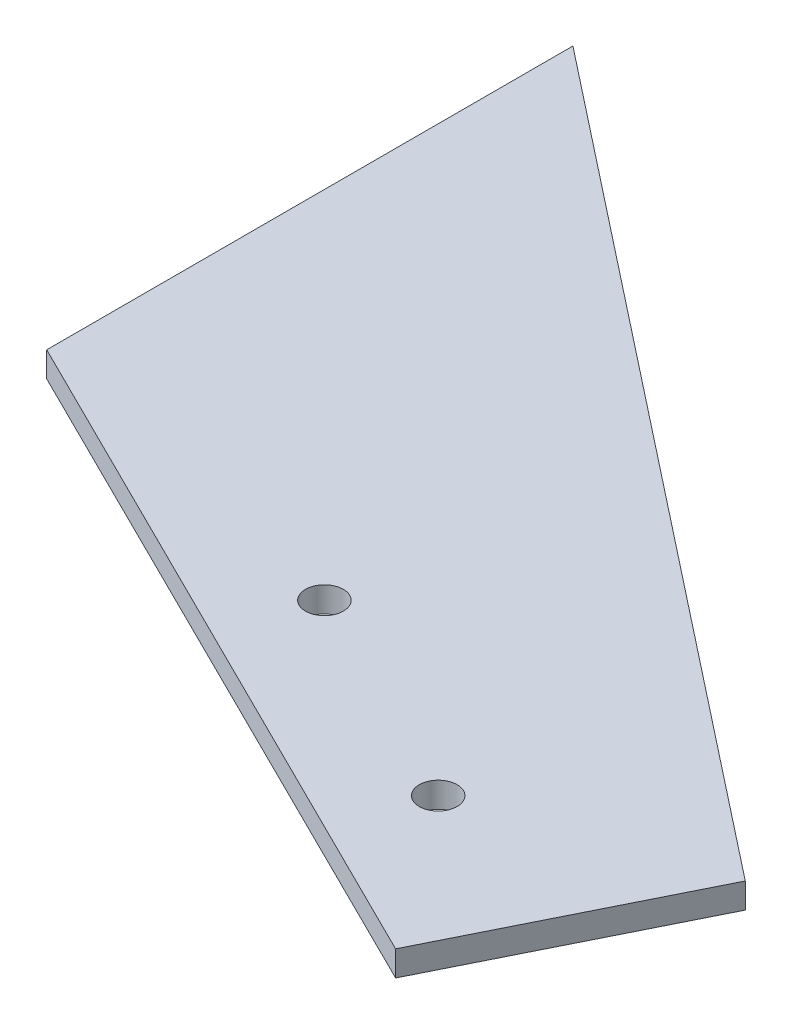
ISO-10303-21;
HEADER;
FILE_DESCRIPTION(('STEP AP214'),'2;1');
FILE_NAME('part.step','',(''),(''),'','','');
FILE_SCHEMA(('AUTOMOTIVE_DESIGN { 1 0 10303 214 1 1 1 1 }'));
ENDSEC;
DATA;
#1=APPLICATION_CONTEXT('core data for automotive mechanical design processes');
#2=APPLICATION_PROTOCOL_DEFINITION('international standard','automotive_design',2000,#1);
#3=PRODUCT_CONTEXT('',#1,'mechanical');
#4=PRODUCT('Part','Part','',(#3));
#5=PRODUCT_RELATED_PRODUCT_CATEGORY('part','',(#4));
#6=PRODUCT_DEFINITION_FORMATION('','',#4);
#7=PRODUCT_DEFINITION_CONTEXT('part definition',#1,'design');
#8=PRODUCT_DEFINITION('design','',#6,#7);
#9=PRODUCT_DEFINITION_SHAPE('','',#8);
#10=(LENGTH_UNIT() NAMED_UNIT(*) SI_UNIT(.MILLI.,.METRE.));
#11=(NAMED_UNIT(*) PLANE_ANGLE_UNIT() SI_UNIT($,.RADIAN.));
#12=(NAMED_UNIT(*) SI_UNIT($,.STERADIAN.) SOLID_ANGLE_UNIT());
#13=UNCERTAINTY_MEASURE_WITH_UNIT(LENGTH_MEASURE(1.E-05),#10,'distance_accuracy_value','');
#14=(GEOMETRIC_REPRESENTATION_CONTEXT(3) GLOBAL_UNCERTAINTY_ASSIGNED_CONTEXT((#13)) GLOBAL_UNIT_ASSIGNED_CONTEXT((#10,
#11,#12)) REPRESENTATION_CONTEXT('',''));
#15=CARTESIAN_POINT('',(0.,0.,0.));
#16=DIRECTION('',(0.,0.,1.));
#17=DIRECTION('',(1.,0.,0.));
#18=AXIS2_PLACEMENT_3D('',#15,#16,#17);
#19=CARTESIAN_POINT('',(188.28380759836,-2024.9,1941.197124518));
#20=DIRECTION('',(0.,1.,0.));
#21=DIRECTION('',(0.895586037746255,0.,0.444888355651126));
#22=AXIS2_PLACEMENT_3D('',#19,#20,#21);
#23=CYLINDRICAL_SURFACE('',#22,4.5);
#24=CARTESIAN_POINT('',(188.28380759836,-2025.,1941.197124518));
#25=DIRECTION('',(0.,1.,0.));
#26=DIRECTION('',(0.895586037746255,0.,0.444888355651126));
#27=AXIS2_PLACEMENT_3D('',#24,#25,#26);
#28=CIRCLE('',#27,4.5);
#29=CARTESIAN_POINT('',(192.31394476822,-2025.,1943.199122119));
#30=VERTEX_POINT('',#29);
#31=EDGE_CURVE('E67',#30,#30,#28,.T.);
#32=ORIENTED_EDGE('',*,*,#31,.T.);
#33=DIRECTION('',(0.,-1.,0.));
#34=VECTOR('',#33,1.);
#35=CARTESIAN_POINT('',(192.31394476822,-2024.9,1943.199122119));
#36=LINE('',#35,#34);
#37=CARTESIAN_POINT('',(192.31394476822,-2031.,1943.199122119));
#38=VERTEX_POINT('',#37);
#39=EDGE_CURVE('E11',#30,#38,#36,.T.);
#40=ORIENTED_EDGE('',*,*,#39,.T.);
#41=CARTESIAN_POINT('',(188.28380759836,-2031.,1941.197124518));
#42=DIRECTION('',(0.,1.,0.));
#43=DIRECTION('',(0.895586037746255,0.,0.444888355651126));
#44=AXIS2_PLACEMENT_3D('',#41,#42,#43);
#45=CIRCLE('',#44,4.5);
#46=EDGE_CURVE('E68',#38,#38,#45,.T.);
#47=ORIENTED_EDGE('',*,*,#46,.F.);
#48=ORIENTED_EDGE('',*,*,#39,.F.);
#49=EDGE_LOOP('',(#32,#40,#47,#48));
#50=FACE_BOUND('',#49,.T.);
#51=ADVANCED_FACE('F17',(#50),#23,.F.);
#52=CARTESIAN_POINT('',(134.54864533358,-2024.9,1914.503823179));
#53=DIRECTION('',(0.,1.,0.));
#54=DIRECTION('',(0.895586037746255,0.,0.444888355651126));
#55=AXIS2_PLACEMENT_3D('',#52,#53,#54);
#56=CYLINDRICAL_SURFACE('',#55,4.5);
#57=CARTESIAN_POINT('',(134.54864533358,-2025.,1914.503823179));
#58=DIRECTION('',(0.,1.,0.));
#59=DIRECTION('',(0.895586037746255,0.,0.444888355651126));
#60=AXIS2_PLACEMENT_3D('',#57,#58,#59);
#61=CIRCLE('',#60,4.5);
#62=CARTESIAN_POINT('',(138.57878250344,-2025.,1916.50582078));
#63=VERTEX_POINT('',#62);
#64=EDGE_CURVE('E84',#63,#63,#61,.T.);
#65=ORIENTED_EDGE('',*,*,#64,.T.);
#66=DIRECTION('',(0.,-1.,0.));
#67=VECTOR('',#66,1.);
#68=CARTESIAN_POINT('',(138.57878250344,-2024.9,1916.50582078));
#69=LINE('',#68,#67);
#70=CARTESIAN_POINT('',(138.57878250344,-2031.,1916.50582078));
#71=VERTEX_POINT('',#70);
#72=EDGE_CURVE('E27',#63,#71,#69,.T.);
#73=ORIENTED_EDGE('',*,*,#72,.T.);
#74=CARTESIAN_POINT('',(134.54864533358,-2031.,1914.503823179));
#75=DIRECTION('',(0.,1.,0.));
#76=DIRECTION('',(0.895586037746255,0.,0.444888355651126));
#77=AXIS2_PLACEMENT_3D('',#74,#75,#76);
#78=CIRCLE('',#77,4.5);
#79=EDGE_CURVE('E71',#71,#71,#78,.T.);
#80=ORIENTED_EDGE('',*,*,#79,.F.);
#81=ORIENTED_EDGE('',*,*,#72,.F.);
#82=EDGE_LOOP('',(#65,#73,#80,#81));
#83=FACE_BOUND('',#82,.T.);
#84=ADVANCED_FACE('F164',(#83),#56,.F.);
#85=CARTESIAN_POINT('',(242.3476716899,-2025.,1922.273631197));
#86=DIRECTION('',(0.618450443005025,0.,-0.785823803118032));
#87=DIRECTION('',(0.,-1.,0.));
#88=AXIS2_PLACEMENT_3D('',#85,#86,#87);
#89=PLANE('',#88);
#90=DIRECTION('',(0.,-1.,0.));
#91=VECTOR('',#90,1.);
#92=CARTESIAN_POINT('',(242.3476716899,-2025.,1922.273631197));
#93=LINE('',#92,#91);
#94=CARTESIAN_POINT('',(242.3476716899,-2025.,1922.273631197));
#95=VERTEX_POINT('',#94);
#96=CARTESIAN_POINT('',(242.3476716899,-2031.,1922.273631197));
#97=VERTEX_POINT('',#96);
#98=EDGE_CURVE('E90',#95,#97,#93,.T.);
#99=ORIENTED_EDGE('',*,*,#98,.T.);
#100=DIRECTION('',(-0.785823803118032,0.,-0.618450443005025));
#101=VECTOR('',#100,1.);
#102=CARTESIAN_POINT('',(242.3476716899,-2031.,1922.273631197));
#103=LINE('',#102,#101);
#104=CARTESIAN_POINT('',(50.,-2031.,1770.89427326));
#105=VERTEX_POINT('',#104);
#106=EDGE_CURVE('E78',#97,#105,#103,.T.);
#107=ORIENTED_EDGE('',*,*,#106,.T.);
#108=DIRECTION('',(0.,-1.,0.));
#109=VECTOR('',#108,1.);
#110=CARTESIAN_POINT('',(50.,-2025.,1770.89427326));
#111=LINE('',#110,#109);
#112=CARTESIAN_POINT('',(50.,-2025.,1770.89427326));
#113=VERTEX_POINT('',#112);
#114=EDGE_CURVE('E103',#113,#105,#111,.T.);
#115=ORIENTED_EDGE('',*,*,#114,.F.);
#116=DIRECTION('',(-0.785823803118032,0.,-0.618450443005025));
#117=VECTOR('',#116,1.);
#118=CARTESIAN_POINT('',(242.3476716899,-2025.,1922.273631197));
#119=LINE('',#118,#117);
#120=EDGE_CURVE('E89',#95,#113,#119,.T.);
#121=ORIENTED_EDGE('',*,*,#120,.F.);
#122=EDGE_LOOP('',(#99,#107,#115,#121));
#123=FACE_BOUND('',#122,.T.);
#124=ADVANCED_FACE('F19',(#123),#89,.T.);
#125=CARTESIAN_POINT('',(130.816885266,-2031.,1881.302171669));
#126=DIRECTION('',(0.,1.,0.));
#127=DIRECTION('',(1.,0.,0.));
#128=AXIS2_PLACEMENT_3D('',#125,#126,#127);
#129=PLANE('',#128);
#130=ORIENTED_EDGE('',*,*,#46,.T.);
#131=EDGE_LOOP('',(#130));
#132=FACE_BOUND('',#131,.T.);
#133=ORIENTED_EDGE('',*,*,#79,.T.);
#134=EDGE_LOOP('',(#133));
#135=FACE_BOUND('',#134,.T.);
#136=DIRECTION('',(0.,0.,1.));
#137=VECTOR('',#136,1.);
#138=CARTESIAN_POINT('',(50.,-2031.,1770.89427326));
#139=LINE('',#138,#137);
#140=CARTESIAN_POINT('',(50.,-2031.,1895.952051384));
#141=VERTEX_POINT('',#140);
#142=EDGE_CURVE('E102',#105,#141,#139,.T.);
#143=ORIENTED_EDGE('',*,*,#142,.F.);
#144=ORIENTED_EDGE('',*,*,#106,.F.);
#145=DIRECTION('',(0.444888355651126,0.,-0.895586037746255));
#146=VECTOR('',#145,1.);
#147=CARTESIAN_POINT('',(214.76459363954,-2031.,1977.799965537));
#148=LINE('',#147,#146);
#149=CARTESIAN_POINT('',(214.76459363954,-2031.,1977.799965537));
#150=VERTEX_POINT('',#149);
#151=EDGE_CURVE('E91',#150,#97,#148,.T.);
#152=ORIENTED_EDGE('',*,*,#151,.F.);
#153=DIRECTION('',(0.895586037746255,0.,0.444888355651126));
#154=VECTOR('',#153,1.);
#155=CARTESIAN_POINT('',(50.,-2031.,1895.952051384));
#156=LINE('',#155,#154);
#157=EDGE_CURVE('E118',#141,#150,#156,.T.);
#158=ORIENTED_EDGE('',*,*,#157,.F.);
#159=EDGE_LOOP('',(#143,#144,#152,#158));
#160=FACE_BOUND('',#159,.T.);
#161=ADVANCED_FACE('F147',(#132,#135,#160),#129,.F.);
#162=CARTESIAN_POINT('',(130.816885266,-2025.,1881.302171669));
#163=DIRECTION('',(0.,1.,0.));
#164=DIRECTION('',(1.,0.,0.));
#165=AXIS2_PLACEMENT_3D('',#162,#163,#164);
#166=PLANE('',#165);
#167=ORIENTED_EDGE('',*,*,#31,.F.);
#168=EDGE_LOOP('',(#167));
#169=FACE_BOUND('',#168,.T.);
#170=ORIENTED_EDGE('',*,*,#64,.F.);
#171=EDGE_LOOP('',(#170));
#172=FACE_BOUND('',#171,.T.);
#173=DIRECTION('',(0.895586037746255,0.,0.444888355651126));
#174=VECTOR('',#173,1.);
#175=CARTESIAN_POINT('',(50.,-2025.,1895.952051384));
#176=LINE('',#175,#174);
#177=CARTESIAN_POINT('',(50.,-2025.,1895.952051384));
#178=VERTEX_POINT('',#177);
#179=CARTESIAN_POINT('',(214.76459363954,-2025.,1977.799965537));
#180=VERTEX_POINT('',#179);
#181=EDGE_CURVE('E107',#178,#180,#176,.T.);
#182=ORIENTED_EDGE('',*,*,#181,.T.);
#183=DIRECTION('',(0.444888355651126,0.,-0.895586037746255));
#184=VECTOR('',#183,1.);
#185=CARTESIAN_POINT('',(214.76459363954,-2025.,1977.799965537));
#186=LINE('',#185,#184);
#187=EDGE_CURVE('E85',#180,#95,#186,.T.);
#188=ORIENTED_EDGE('',*,*,#187,.T.);
#189=ORIENTED_EDGE('',*,*,#120,.T.);
#190=DIRECTION('',(0.,0.,1.));
#191=VECTOR('',#190,1.);
#192=CARTESIAN_POINT('',(50.,-2025.,1770.89427326));
#193=LINE('',#192,#191);
#194=EDGE_CURVE('E95',#113,#178,#193,.T.);
#195=ORIENTED_EDGE('',*,*,#194,.T.);
#196=EDGE_LOOP('',(#182,#188,#189,#195));
#197=FACE_BOUND('',#196,.T.);
#198=ADVANCED_FACE('F133',(#169,#172,#197),#166,.T.);
#199=CARTESIAN_POINT('',(214.76459363954,-2025.,1977.799965537));
#200=DIRECTION('',(0.895586037746255,0.,0.444888355651126));
#201=DIRECTION('',(0.,-1.,0.));
#202=AXIS2_PLACEMENT_3D('',#199,#200,#201);
#203=PLANE('',#202);
#204=DIRECTION('',(0.,-1.,0.));
#205=VECTOR('',#204,1.);
#206=CARTESIAN_POINT('',(214.76459363954,-2025.,1977.799965537));
#207=LINE('',#206,#205);
#208=EDGE_CURVE('E111',#180,#150,#207,.T.);
#209=ORIENTED_EDGE('',*,*,#208,.T.);
#210=ORIENTED_EDGE('',*,*,#151,.T.);
#211=ORIENTED_EDGE('',*,*,#98,.F.);
#212=ORIENTED_EDGE('',*,*,#187,.F.);
#213=EDGE_LOOP('',(#209,#210,#211,#212));
#214=FACE_BOUND('',#213,.T.);
#215=ADVANCED_FACE('F182',(#214),#203,.T.);
#216=CARTESIAN_POINT('',(50.,-2025.,1770.89427326));
#217=DIRECTION('',(-1.,0.,0.));
#218=DIRECTION('',(0.,0.,1.));
#219=AXIS2_PLACEMENT_3D('',#216,#217,#218);
#220=PLANE('',#219);
#221=ORIENTED_EDGE('',*,*,#114,.T.);
#222=ORIENTED_EDGE('',*,*,#142,.T.);
#223=DIRECTION('',(0.,-1.,0.));
#224=VECTOR('',#223,1.);
#225=CARTESIAN_POINT('',(50.,-2025.,1895.952051384));
#226=LINE('',#225,#224);
#227=EDGE_CURVE('E125',#178,#141,#226,.T.);
#228=ORIENTED_EDGE('',*,*,#227,.F.);
#229=ORIENTED_EDGE('',*,*,#194,.F.);
#230=EDGE_LOOP('',(#221,#222,#228,#229));
#231=FACE_BOUND('',#230,.T.);
#232=ADVANCED_FACE('F142',(#231),#220,.T.);
#233=CARTESIAN_POINT('',(50.,-2025.,1895.952051384));
#234=DIRECTION('',(-0.444888355651126,0.,0.895586037746255));
#235=DIRECTION('',(0.,1.,0.));
#236=AXIS2_PLACEMENT_3D('',#233,#234,#235);
#237=PLANE('',#236);
#238=ORIENTED_EDGE('',*,*,#227,.T.);
#239=ORIENTED_EDGE('',*,*,#157,.T.);
#240=ORIENTED_EDGE('',*,*,#208,.F.);
#241=ORIENTED_EDGE('',*,*,#181,.F.);
#242=EDGE_LOOP('',(#238,#239,#240,#241));
#243=FACE_BOUND('',#242,.T.);
#244=ADVANCED_FACE('F197',(#243),#237,.T.);
#245=CLOSED_SHELL('',(#51,#84,#124,#161,#198,#215,#232,#244));
#246=MANIFOLD_SOLID_BREP('B1',#245);
#247=ADVANCED_BREP_SHAPE_REPRESENTATION('',(#18,#246),#14);
#248=SHAPE_DEFINITION_REPRESENTATION(#9,#247);
ENDSEC;
END-ISO-10303-21;
